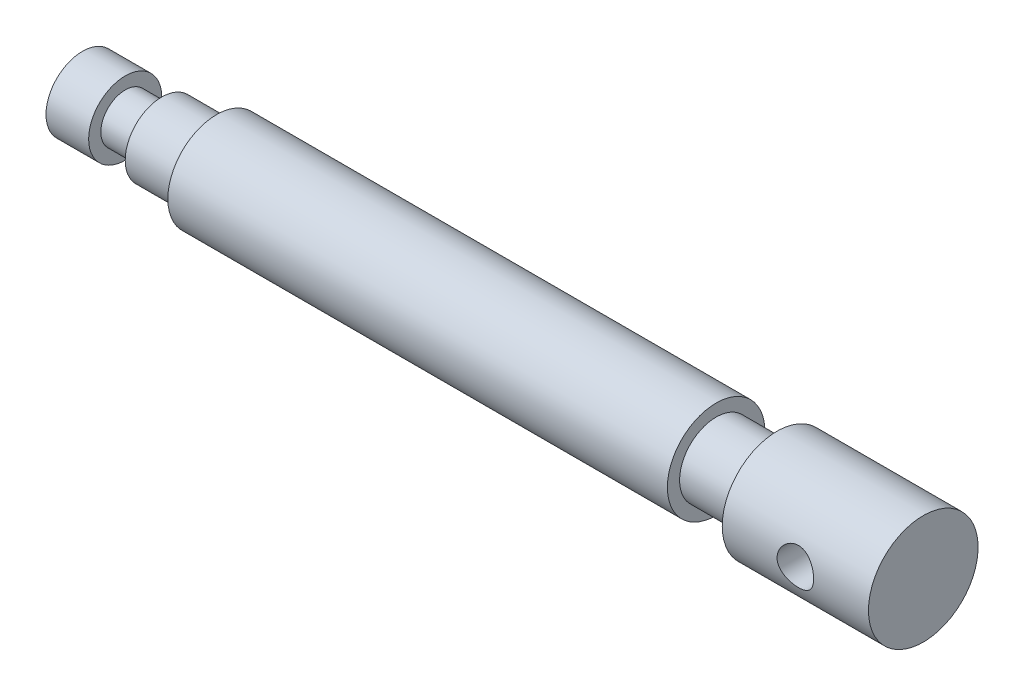
ISO-10303-21;
HEADER;
FILE_DESCRIPTION(('STEP AP214'),'2;1');
FILE_NAME('part.step','',(''),(''),'','','');
FILE_SCHEMA(('AUTOMOTIVE_DESIGN { 1 0 10303 214 1 1 1 1 }'));
ENDSEC;
DATA;
#1=APPLICATION_CONTEXT('core data for automotive mechanical design processes');
#2=APPLICATION_PROTOCOL_DEFINITION('international standard','automotive_design',2000,#1);
#3=PRODUCT_CONTEXT('',#1,'mechanical');
#4=PRODUCT('Part','Part','',(#3));
#5=PRODUCT_RELATED_PRODUCT_CATEGORY('part','',(#4));
#6=PRODUCT_DEFINITION_FORMATION('','',#4);
#7=PRODUCT_DEFINITION_CONTEXT('part definition',#1,'design');
#8=PRODUCT_DEFINITION('design','',#6,#7);
#9=PRODUCT_DEFINITION_SHAPE('','',#8);
#10=(LENGTH_UNIT() NAMED_UNIT(*) SI_UNIT(.MILLI.,.METRE.));
#11=(NAMED_UNIT(*) PLANE_ANGLE_UNIT() SI_UNIT($,.RADIAN.));
#12=(NAMED_UNIT(*) SI_UNIT($,.STERADIAN.) SOLID_ANGLE_UNIT());
#13=UNCERTAINTY_MEASURE_WITH_UNIT(LENGTH_MEASURE(1.E-05),#10,'distance_accuracy_value','');
#14=(GEOMETRIC_REPRESENTATION_CONTEXT(3) GLOBAL_UNCERTAINTY_ASSIGNED_CONTEXT((#13)) GLOBAL_UNIT_ASSIGNED_CONTEXT((#10,
#11,#12)) REPRESENTATION_CONTEXT('',''));
#15=CARTESIAN_POINT('',(0.,0.,0.));
#16=DIRECTION('',(0.,0.,1.));
#17=DIRECTION('',(1.,0.,0.));
#18=AXIS2_PLACEMENT_3D('',#15,#16,#17);
#19=CARTESIAN_POINT('',(0.,0.,0.));
#20=DIRECTION('',(1.,0.,0.));
#21=DIRECTION('',(0.,0.,-1.));
#22=AXIS2_PLACEMENT_3D('',#19,#20,#21);
#23=PLANE('',#22);
#24=CARTESIAN_POINT('',(0.,0.,0.));
#25=DIRECTION('',(-1.,0.,0.));
#26=DIRECTION('',(0.,0.,1.));
#27=AXIS2_PLACEMENT_3D('',#24,#25,#26);
#28=CIRCLE('',#27,6.);
#29=CARTESIAN_POINT('',(0.,0.,6.));
#30=VERTEX_POINT('',#29);
#31=EDGE_CURVE('E10',#30,#30,#28,.T.);
#32=ORIENTED_EDGE('',*,*,#31,.T.);
#33=EDGE_LOOP('',(#32));
#34=FACE_BOUND('',#33,.T.);
#35=ADVANCED_FACE('F41',(#34),#23,.F.);
#36=CARTESIAN_POINT('',(0.,0.,0.));
#37=DIRECTION('',(-1.,0.,0.));
#38=DIRECTION('',(0.,0.,1.));
#39=AXIS2_PLACEMENT_3D('',#36,#37,#38);
#40=CYLINDRICAL_SURFACE('',#39,6.);
#41=ORIENTED_EDGE('',*,*,#31,.F.);
#42=EDGE_LOOP('',(#41));
#43=FACE_BOUND('',#42,.T.);
#44=CARTESIAN_POINT('',(7.,0.,0.));
#45=DIRECTION('',(-1.,0.,0.));
#46=DIRECTION('',(0.,0.,1.));
#47=AXIS2_PLACEMENT_3D('',#44,#45,#46);
#48=CIRCLE('',#47,6.);
#49=CARTESIAN_POINT('',(7.,0.,6.));
#50=VERTEX_POINT('',#49);
#51=EDGE_CURVE('E54',#50,#50,#48,.T.);
#52=ORIENTED_EDGE('',*,*,#51,.T.);
#53=EDGE_LOOP('',(#52));
#54=FACE_BOUND('',#53,.T.);
#55=ADVANCED_FACE('F88',(#43,#54),#40,.T.);
#56=CARTESIAN_POINT('',(7.,6.,0.));
#57=DIRECTION('',(-1.,0.,0.));
#58=DIRECTION('',(0.,0.,1.));
#59=AXIS2_PLACEMENT_3D('',#56,#57,#58);
#60=PLANE('',#59);
#61=ORIENTED_EDGE('',*,*,#51,.F.);
#62=EDGE_LOOP('',(#61));
#63=FACE_BOUND('',#62,.T.);
#64=CARTESIAN_POINT('',(7.,0.,0.));
#65=DIRECTION('',(-1.,0.,0.));
#66=DIRECTION('',(0.,0.,1.));
#67=AXIS2_PLACEMENT_3D('',#64,#65,#66);
#68=CIRCLE('',#67,4.);
#69=CARTESIAN_POINT('',(7.,0.,4.));
#70=VERTEX_POINT('',#69);
#71=EDGE_CURVE('E60',#70,#70,#68,.T.);
#72=ORIENTED_EDGE('',*,*,#71,.T.);
#73=EDGE_LOOP('',(#72));
#74=FACE_BOUND('',#73,.T.);
#75=ADVANCED_FACE('F92',(#63,#74),#60,.F.);
#76=CARTESIAN_POINT('',(0.,0.,0.));
#77=DIRECTION('',(-1.,0.,0.));
#78=DIRECTION('',(0.,0.,1.));
#79=AXIS2_PLACEMENT_3D('',#76,#77,#78);
#80=CYLINDRICAL_SURFACE('',#79,4.);
#81=ORIENTED_EDGE('',*,*,#71,.F.);
#82=EDGE_LOOP('',(#81));
#83=FACE_BOUND('',#82,.T.);
#84=CARTESIAN_POINT('',(13.,0.,0.));
#85=DIRECTION('',(-1.,0.,0.));
#86=DIRECTION('',(0.,0.,1.));
#87=AXIS2_PLACEMENT_3D('',#84,#85,#86);
#88=CIRCLE('',#87,4.);
#89=CARTESIAN_POINT('',(13.,0.,4.));
#90=VERTEX_POINT('',#89);
#91=EDGE_CURVE('E169',#90,#90,#88,.T.);
#92=ORIENTED_EDGE('',*,*,#91,.T.);
#93=EDGE_LOOP('',(#92));
#94=FACE_BOUND('',#93,.T.);
#95=ADVANCED_FACE('F97',(#83,#94),#80,.T.);
#96=CARTESIAN_POINT('',(13.,4.,0.));
#97=DIRECTION('',(1.,0.,0.));
#98=DIRECTION('',(0.,0.,-1.));
#99=AXIS2_PLACEMENT_3D('',#96,#97,#98);
#100=PLANE('',#99);
#101=ORIENTED_EDGE('',*,*,#91,.F.);
#102=EDGE_LOOP('',(#101));
#103=FACE_BOUND('',#102,.T.);
#104=CARTESIAN_POINT('',(13.,0.,0.));
#105=DIRECTION('',(-1.,0.,0.));
#106=DIRECTION('',(0.,0.,1.));
#107=AXIS2_PLACEMENT_3D('',#104,#105,#106);
#108=CIRCLE('',#107,6.);
#109=CARTESIAN_POINT('',(13.,0.,6.));
#110=VERTEX_POINT('',#109);
#111=EDGE_CURVE('E165',#110,#110,#108,.T.);
#112=ORIENTED_EDGE('',*,*,#111,.T.);
#113=EDGE_LOOP('',(#112));
#114=FACE_BOUND('',#113,.T.);
#115=ADVANCED_FACE('F104',(#103,#114),#100,.F.);
#116=CARTESIAN_POINT('',(0.,0.,0.));
#117=DIRECTION('',(-1.,0.,0.));
#118=DIRECTION('',(0.,0.,1.));
#119=AXIS2_PLACEMENT_3D('',#116,#117,#118);
#120=CYLINDRICAL_SURFACE('',#119,6.);
#121=ORIENTED_EDGE('',*,*,#111,.F.);
#122=EDGE_LOOP('',(#121));
#123=FACE_BOUND('',#122,.T.);
#124=CARTESIAN_POINT('',(22.,0.,0.));
#125=DIRECTION('',(-1.,0.,0.));
#126=DIRECTION('',(0.,0.,1.));
#127=AXIS2_PLACEMENT_3D('',#124,#125,#126);
#128=CIRCLE('',#127,6.);
#129=CARTESIAN_POINT('',(22.,0.,6.));
#130=VERTEX_POINT('',#129);
#131=EDGE_CURVE('E161',#130,#130,#128,.T.);
#132=ORIENTED_EDGE('',*,*,#131,.T.);
#133=EDGE_LOOP('',(#132));
#134=FACE_BOUND('',#133,.T.);
#135=ADVANCED_FACE('F108',(#123,#134),#120,.T.);
#136=CARTESIAN_POINT('',(22.,6.,0.));
#137=DIRECTION('',(1.,0.,0.));
#138=DIRECTION('',(0.,0.,-1.));
#139=AXIS2_PLACEMENT_3D('',#136,#137,#138);
#140=PLANE('',#139);
#141=ORIENTED_EDGE('',*,*,#131,.F.);
#142=EDGE_LOOP('',(#141));
#143=FACE_BOUND('',#142,.T.);
#144=CARTESIAN_POINT('',(22.,0.,0.));
#145=DIRECTION('',(-1.,0.,0.));
#146=DIRECTION('',(0.,0.,1.));
#147=AXIS2_PLACEMENT_3D('',#144,#145,#146);
#148=CIRCLE('',#147,8.);
#149=CARTESIAN_POINT('',(22.,0.,8.));
#150=VERTEX_POINT('',#149);
#151=EDGE_CURVE('E157',#150,#150,#148,.T.);
#152=ORIENTED_EDGE('',*,*,#151,.T.);
#153=EDGE_LOOP('',(#152));
#154=FACE_BOUND('',#153,.T.);
#155=ADVANCED_FACE('F112',(#143,#154),#140,.F.);
#156=CARTESIAN_POINT('',(0.,0.,0.));
#157=DIRECTION('',(-1.,0.,0.));
#158=DIRECTION('',(0.,0.,1.));
#159=AXIS2_PLACEMENT_3D('',#156,#157,#158);
#160=CYLINDRICAL_SURFACE('',#159,8.);
#161=ORIENTED_EDGE('',*,*,#151,.F.);
#162=EDGE_LOOP('',(#161));
#163=FACE_BOUND('',#162,.T.);
#164=CARTESIAN_POINT('',(104.,0.,0.));
#165=DIRECTION('',(-1.,0.,0.));
#166=DIRECTION('',(0.,0.,1.));
#167=AXIS2_PLACEMENT_3D('',#164,#165,#166);
#168=CIRCLE('',#167,8.);
#169=CARTESIAN_POINT('',(104.,0.,8.));
#170=VERTEX_POINT('',#169);
#171=EDGE_CURVE('E153',#170,#170,#168,.T.);
#172=ORIENTED_EDGE('',*,*,#171,.T.);
#173=EDGE_LOOP('',(#172));
#174=FACE_BOUND('',#173,.T.);
#175=ADVANCED_FACE('F116',(#163,#174),#160,.T.);
#176=CARTESIAN_POINT('',(104.,8.,0.));
#177=DIRECTION('',(-1.,0.,0.));
#178=DIRECTION('',(0.,0.,1.));
#179=AXIS2_PLACEMENT_3D('',#176,#177,#178);
#180=PLANE('',#179);
#181=ORIENTED_EDGE('',*,*,#171,.F.);
#182=EDGE_LOOP('',(#181));
#183=FACE_BOUND('',#182,.T.);
#184=CARTESIAN_POINT('',(104.,0.,0.));
#185=DIRECTION('',(-1.,0.,0.));
#186=DIRECTION('',(0.,0.,1.));
#187=AXIS2_PLACEMENT_3D('',#184,#185,#186);
#188=CIRCLE('',#187,6.);
#189=CARTESIAN_POINT('',(104.,0.,6.));
#190=VERTEX_POINT('',#189);
#191=EDGE_CURVE('E145',#190,#190,#188,.T.);
#192=ORIENTED_EDGE('',*,*,#191,.T.);
#193=EDGE_LOOP('',(#192));
#194=FACE_BOUND('',#193,.T.);
#195=ADVANCED_FACE('F120',(#183,#194),#180,.F.);
#196=CARTESIAN_POINT('',(0.,0.,0.));
#197=DIRECTION('',(-1.,0.,0.));
#198=DIRECTION('',(0.,0.,1.));
#199=AXIS2_PLACEMENT_3D('',#196,#197,#198);
#200=CYLINDRICAL_SURFACE('',#199,6.);
#201=ORIENTED_EDGE('',*,*,#191,.F.);
#202=EDGE_LOOP('',(#201));
#203=FACE_BOUND('',#202,.T.);
#204=CARTESIAN_POINT('',(114.,0.,0.));
#205=DIRECTION('',(-1.,0.,0.));
#206=DIRECTION('',(0.,0.,1.));
#207=AXIS2_PLACEMENT_3D('',#204,#205,#206);
#208=CIRCLE('',#207,6.);
#209=CARTESIAN_POINT('',(114.,0.,6.));
#210=VERTEX_POINT('',#209);
#211=EDGE_CURVE('E135',#210,#210,#208,.T.);
#212=ORIENTED_EDGE('',*,*,#211,.T.);
#213=EDGE_LOOP('',(#212));
#214=FACE_BOUND('',#213,.T.);
#215=ADVANCED_FACE('F124',(#203,#214),#200,.T.);
#216=CARTESIAN_POINT('',(114.,6.,0.));
#217=DIRECTION('',(1.,0.,0.));
#218=DIRECTION('',(0.,0.,-1.));
#219=AXIS2_PLACEMENT_3D('',#216,#217,#218);
#220=PLANE('',#219);
#221=ORIENTED_EDGE('',*,*,#211,.F.);
#222=EDGE_LOOP('',(#221));
#223=FACE_BOUND('',#222,.T.);
#224=CARTESIAN_POINT('',(114.,0.,0.));
#225=DIRECTION('',(-1.,0.,0.));
#226=DIRECTION('',(0.,0.,1.));
#227=AXIS2_PLACEMENT_3D('',#224,#225,#226);
#228=CIRCLE('',#227,9.);
#229=CARTESIAN_POINT('',(114.,0.,9.));
#230=VERTEX_POINT('',#229);
#231=EDGE_CURVE('E138',#230,#230,#228,.T.);
#232=ORIENTED_EDGE('',*,*,#231,.T.);
#233=EDGE_LOOP('',(#232));
#234=FACE_BOUND('',#233,.T.);
#235=ADVANCED_FACE('F84',(#223,#234),#220,.F.);
#236=CARTESIAN_POINT('',(0.,0.,0.));
#237=DIRECTION('',(-1.,0.,0.));
#238=DIRECTION('',(0.,0.,1.));
#239=AXIS2_PLACEMENT_3D('',#236,#237,#238);
#240=CYLINDRICAL_SURFACE('',#239,9.);
#241=CARTESIAN_POINT('',(129.,0.,9.));
#242=CARTESIAN_POINT('',(129.000000761195,-0.163690088660168,9.00000045902832));
#243=CARTESIAN_POINT('',(128.986559201618,-0.327375583615647,8.99549308522634));
#244=CARTESIAN_POINT('',(128.933312673548,-0.649925282618914,8.97795630609842));
#245=CARTESIAN_POINT('',(128.893504968153,-0.808788984356453,8.96492601606458));
#246=CARTESIAN_POINT('',(128.789042269848,-1.11699836850533,8.93175923719328));
#247=CARTESIAN_POINT('',(128.724428812622,-1.26635947765811,8.9116346319256));
#248=CARTESIAN_POINT('',(128.572376481485,-1.55212481041598,8.86633337152025));
#249=CARTESIAN_POINT('',(128.484933104992,-1.68852647087612,8.84115572003334));
#250=CARTESIAN_POINT('',(128.286522585424,-1.94922502506679,8.78742283329015));
#251=CARTESIAN_POINT('',(128.174906297219,-2.07301110089492,8.75878669391355));
#252=CARTESIAN_POINT('',(127.93269853588,-2.30049807810625,8.70180944349364));
#253=CARTESIAN_POINT('',(127.802102895214,-2.40419455646838,8.67346839871647));
#254=CARTESIAN_POINT('',(127.521044654411,-2.59147482668358,8.61939997431822));
#255=CARTESIAN_POINT('',(127.370118780804,-2.6743945746631,8.59377117827064));
#256=CARTESIAN_POINT('',(127.055471716624,-2.81345662163316,8.54925916255804));
#257=CARTESIAN_POINT('',(126.891754448512,-2.86960709216029,8.53037388482237));
#258=CARTESIAN_POINT('',(126.56198033551,-2.95162038452748,8.50233909808132));
#259=CARTESIAN_POINT('',(126.396188374533,-2.9784403448153,8.49288287308834));
#260=CARTESIAN_POINT('',(126.062208737532,-3.00402337000343,8.48386969888523));
#261=CARTESIAN_POINT('',(125.894021817872,-3.00279510481415,8.4843096906819));
#262=CARTESIAN_POINT('',(125.568190108668,-2.97305971111025,8.49477045024541));
#263=CARTESIAN_POINT('',(125.410414791243,-2.94580173950098,8.50435247602599));
#264=CARTESIAN_POINT('',(125.101819741179,-2.86681848854824,8.53129973173653));
#265=CARTESIAN_POINT('',(124.951000843695,-2.8150902797756,8.54866589352323));
#266=CARTESIAN_POINT('',(124.657761751226,-2.68781717418062,8.58953733393747));
#267=CARTESIAN_POINT('',(124.515515923591,-2.61190214612178,8.61313697379352));
#268=CARTESIAN_POINT('',(124.245387275161,-2.43866731890941,8.6637767572718));
#269=CARTESIAN_POINT('',(124.1175086192,-2.34134133709201,8.69081789371391));
#270=CARTESIAN_POINT('',(123.872725205518,-2.1220479980467,8.74701987503223));
#271=CARTESIAN_POINT('',(123.756741916473,-1.99905945022893,8.77621768064529));
#272=CARTESIAN_POINT('',(123.54680620001,-1.73501870991019,8.8322081516111));
#273=CARTESIAN_POINT('',(123.452855885507,-1.59396478698244,8.85900058614202));
#274=CARTESIAN_POINT('',(123.288911099295,-1.2958428391388,8.90751323813381));
#275=CARTESIAN_POINT('',(123.219163525978,-1.138629829249,8.92918050024118));
#276=CARTESIAN_POINT('',(123.107390478133,-0.813807250093516,8.96461701433304));
#277=CARTESIAN_POINT('',(123.06535537373,-0.646201314464853,8.97838900964638));
#278=CARTESIAN_POINT('',(123.011833001933,-0.313151488587904,8.99602881214321));
#279=CARTESIAN_POINT('',(122.999100572482,-0.147928799594531,9.00030005501184));
#280=CARTESIAN_POINT('',(123.000998020795,0.182325209880718,8.99966708084482));
#281=CARTESIAN_POINT('',(123.01562327994,0.347356557958957,8.99476441258087));
#282=CARTESIAN_POINT('',(123.070835723208,0.667559598912772,8.97660074151313));
#283=CARTESIAN_POINT('',(123.110658618148,0.822878420504535,8.96358596133577));
#284=CARTESIAN_POINT('',(123.2141803334,1.12456787573872,8.9307554049021));
#285=CARTESIAN_POINT('',(123.277882198403,1.27093736552582,8.91093876140025));
#286=CARTESIAN_POINT('',(123.429211295522,1.55486488917982,8.86586793861869));
#287=CARTESIAN_POINT('',(123.51742377985,1.69208987765145,8.84048444267358));
#288=CARTESIAN_POINT('',(123.71458245004,1.95019449040676,8.78715761748787));
#289=CARTESIAN_POINT('',(123.823534968095,2.07106910338673,8.75921350781483));
#290=CARTESIAN_POINT('',(124.06493625302,2.2987575234189,8.70230543941334));
#291=CARTESIAN_POINT('',(124.198227680781,2.40468290773732,8.67335283262284));
#292=CARTESIAN_POINT('',(124.481314703433,2.59277256697073,8.61899919884126));
#293=CARTESIAN_POINT('',(124.631110435902,2.67493664379304,8.59359820146007));
#294=CARTESIAN_POINT('',(124.94301904587,2.81279079124908,8.54947175374151));
#295=CARTESIAN_POINT('',(125.105106237506,2.86853439649506,8.53073282378937));
#296=CARTESIAN_POINT('',(125.437135950132,2.95168400027806,8.50232496919349));
#297=CARTESIAN_POINT('',(125.607074896213,2.97910276486182,8.49265195870918));
#298=CARTESIAN_POINT('',(125.940591288123,3.00382884743202,8.48393576622532));
#299=CARTESIAN_POINT('',(126.10404702086,3.00261077192519,8.48437200772245));
#300=CARTESIAN_POINT('',(126.428295224766,2.97372688034607,8.49453809471602));
#301=CARTESIAN_POINT('',(126.589087853865,2.94606263837575,8.50426738708085));
#302=CARTESIAN_POINT('',(126.900406989007,2.86611543938802,8.53153572914676));
#303=CARTESIAN_POINT('',(127.051070475014,2.81431003804652,8.54892294067433));
#304=CARTESIAN_POINT('',(127.341682220815,2.68793809727922,8.58949196455406));
#305=CARTESIAN_POINT('',(127.481628093564,2.6133665056614,8.6126750629018));
#306=CARTESIAN_POINT('',(127.753451009769,2.43978207775028,8.66348487678139));
#307=CARTESIAN_POINT('',(127.884709505695,2.33984472829373,8.69126134926412));
#308=CARTESIAN_POINT('',(128.129069440153,2.11992864940694,8.74750068849759));
#309=CARTESIAN_POINT('',(128.242165727064,1.99994425335444,8.77596374737117));
#310=CARTESIAN_POINT('',(128.451433236868,1.73772467076206,8.83170091576632));
#311=CARTESIAN_POINT('',(128.546773043253,1.59480454049917,8.8588854540377));
#312=CARTESIAN_POINT('',(128.711971286552,1.29407207221985,8.90777973517837));
#313=CARTESIAN_POINT('',(128.781836237766,1.13626355439703,8.9294908772379));
#314=CARTESIAN_POINT('',(128.891164897466,0.817480941602912,8.96416545205626));
#315=CARTESIAN_POINT('',(128.93184739879,0.656963273029215,8.97747637267568));
#316=CARTESIAN_POINT('',(128.986260842031,0.330961248030737,8.99539221192665));
#317=CARTESIAN_POINT('',(128.99999923049,0.165478276706237,8.99999953595715));
#318=CARTESIAN_POINT('',(129.,0.,9.));
#319=B_SPLINE_CURVE_WITH_KNOTS('',3,(#241,#242,#243,#244,#245,#246,#247,#248,#249,#250,#251,
#252,#253,#254,#255,#256,#257,#258,#259,#260,#261,#262,#263,#264,#265,#266,#267,#268,#269,#270,
#271,#272,#273,#274,#275,#276,#277,#278,#279,#280,#281,#282,#283,#284,#285,#286,#287,#288,#289,
#290,#291,#292,#293,#294,#295,#296,#297,#298,#299,#300,#301,#302,#303,#304,#305,#306,#307,#308,
#309,#310,#311,#312,#313,#314,#315,#316,#317,#318),.UNSPECIFIED.,.T.,.F.,(4,2,2,2,2,2,2,2,2,2,2,
2,2,2,2,2,2,2,2,2,2,2,2,2,2,2,2,2,2,2,2,2,2,2,2,2,2,2,4),(0.,0.490461318078029,
0.980973555802563,1.47066801861083,1.96045913339731,2.46554052848266,2.97073299862591,
3.49045154470411,4.01001134078499,4.51205777225523,5.01394901962458,5.49290479653844,
5.97191792566448,6.45864513465392,6.94551307674621,7.457799174341,7.97013437899854,
8.48755216951072,9.00479006631624,9.49960749525508,9.99434139492529,10.4747447393464,
10.9552093585231,11.4483119953121,11.9415654246567,12.4572306864225,12.9729002470499,
13.4875204148031,14.0019085411752,14.4898699819277,14.9778023805413,15.4564676124125,
15.9352391452793,16.4349020007541,16.9347063337134,17.453989825053,17.9731404345737,
18.4690967512144,18.9649159811442),.UNSPECIFIED.);
#320=CARTESIAN_POINT('',(129.,0.,9.));
#321=VERTEX_POINT('',#320);
#322=EDGE_CURVE('E44',#321,#321,#319,.T.);
#323=ORIENTED_EDGE('',*,*,#322,.T.);
#324=EDGE_LOOP('',(#323));
#325=FACE_BOUND('',#324,.T.);
#326=CARTESIAN_POINT('',(129.,0.,-9.));
#327=CARTESIAN_POINT('',(129.000000761195,0.163690088660168,-9.00000045902832));
#328=CARTESIAN_POINT('',(128.986559201618,0.327375583615647,-8.99549308522634));
#329=CARTESIAN_POINT('',(128.933312673548,0.649925282618914,-8.97795630609842));
#330=CARTESIAN_POINT('',(128.893504968153,0.808788984356453,-8.96492601606458));
#331=CARTESIAN_POINT('',(128.789042269848,1.11699836850533,-8.93175923719328));
#332=CARTESIAN_POINT('',(128.724428812622,1.26635947765811,-8.9116346319256));
#333=CARTESIAN_POINT('',(128.572376481485,1.55212481041598,-8.86633337152025));
#334=CARTESIAN_POINT('',(128.484933104992,1.68852647087612,-8.84115572003334));
#335=CARTESIAN_POINT('',(128.286522585424,1.94922502506679,-8.78742283329015));
#336=CARTESIAN_POINT('',(128.174906297219,2.07301110089492,-8.75878669391355));
#337=CARTESIAN_POINT('',(127.93269853588,2.30049807810625,-8.70180944349364));
#338=CARTESIAN_POINT('',(127.802102895214,2.40419455646838,-8.67346839871647));
#339=CARTESIAN_POINT('',(127.521044654411,2.59147482668358,-8.61939997431822));
#340=CARTESIAN_POINT('',(127.370118780804,2.6743945746631,-8.59377117827064));
#341=CARTESIAN_POINT('',(127.055471716624,2.81345662163316,-8.54925916255804));
#342=CARTESIAN_POINT('',(126.891754448512,2.86960709216029,-8.53037388482237));
#343=CARTESIAN_POINT('',(126.56198033551,2.95162038452748,-8.50233909808132));
#344=CARTESIAN_POINT('',(126.396188374533,2.9784403448153,-8.49288287308834));
#345=CARTESIAN_POINT('',(126.062208737532,3.00402337000343,-8.48386969888523));
#346=CARTESIAN_POINT('',(125.894021817872,3.00279510481415,-8.4843096906819));
#347=CARTESIAN_POINT('',(125.568190108668,2.97305971111025,-8.49477045024541));
#348=CARTESIAN_POINT('',(125.410414791243,2.94580173950098,-8.50435247602599));
#349=CARTESIAN_POINT('',(125.101819741179,2.86681848854824,-8.53129973173653));
#350=CARTESIAN_POINT('',(124.951000843695,2.8150902797756,-8.54866589352323));
#351=CARTESIAN_POINT('',(124.657761751226,2.68781717418062,-8.58953733393747));
#352=CARTESIAN_POINT('',(124.515515923591,2.61190214612178,-8.61313697379352));
#353=CARTESIAN_POINT('',(124.245387275161,2.43866731890941,-8.6637767572718));
#354=CARTESIAN_POINT('',(124.1175086192,2.34134133709201,-8.69081789371391));
#355=CARTESIAN_POINT('',(123.872725205518,2.1220479980467,-8.74701987503223));
#356=CARTESIAN_POINT('',(123.756741916473,1.99905945022893,-8.77621768064529));
#357=CARTESIAN_POINT('',(123.54680620001,1.73501870991019,-8.8322081516111));
#358=CARTESIAN_POINT('',(123.452855885507,1.59396478698244,-8.85900058614202));
#359=CARTESIAN_POINT('',(123.288911099295,1.2958428391388,-8.90751323813381));
#360=CARTESIAN_POINT('',(123.219163525978,1.138629829249,-8.92918050024118));
#361=CARTESIAN_POINT('',(123.107390478133,0.813807250093516,-8.96461701433304));
#362=CARTESIAN_POINT('',(123.06535537373,0.646201314464853,-8.97838900964638));
#363=CARTESIAN_POINT('',(123.011833001933,0.313151488587904,-8.99602881214321));
#364=CARTESIAN_POINT('',(122.999100572482,0.147928799594531,-9.00030005501184));
#365=CARTESIAN_POINT('',(123.000998020795,-0.182325209880718,-8.99966708084482));
#366=CARTESIAN_POINT('',(123.01562327994,-0.347356557958957,-8.99476441258087));
#367=CARTESIAN_POINT('',(123.070835723208,-0.667559598912772,-8.97660074151313));
#368=CARTESIAN_POINT('',(123.110658618148,-0.822878420504535,-8.96358596133577));
#369=CARTESIAN_POINT('',(123.2141803334,-1.12456787573872,-8.9307554049021));
#370=CARTESIAN_POINT('',(123.277882198403,-1.27093736552582,-8.91093876140025));
#371=CARTESIAN_POINT('',(123.429211295522,-1.55486488917982,-8.86586793861869));
#372=CARTESIAN_POINT('',(123.51742377985,-1.69208987765145,-8.84048444267358));
#373=CARTESIAN_POINT('',(123.71458245004,-1.95019449040676,-8.78715761748787));
#374=CARTESIAN_POINT('',(123.823534968095,-2.07106910338673,-8.75921350781483));
#375=CARTESIAN_POINT('',(124.06493625302,-2.2987575234189,-8.70230543941334));
#376=CARTESIAN_POINT('',(124.198227680781,-2.40468290773732,-8.67335283262284));
#377=CARTESIAN_POINT('',(124.481314703433,-2.59277256697073,-8.61899919884126));
#378=CARTESIAN_POINT('',(124.631110435902,-2.67493664379304,-8.59359820146007));
#379=CARTESIAN_POINT('',(124.94301904587,-2.81279079124908,-8.54947175374151));
#380=CARTESIAN_POINT('',(125.105106237506,-2.86853439649506,-8.53073282378937));
#381=CARTESIAN_POINT('',(125.437135950132,-2.95168400027806,-8.50232496919349));
#382=CARTESIAN_POINT('',(125.607074896213,-2.97910276486182,-8.49265195870918));
#383=CARTESIAN_POINT('',(125.940591288123,-3.00382884743202,-8.48393576622532));
#384=CARTESIAN_POINT('',(126.10404702086,-3.00261077192519,-8.48437200772245));
#385=CARTESIAN_POINT('',(126.428295224766,-2.97372688034607,-8.49453809471602));
#386=CARTESIAN_POINT('',(126.589087853865,-2.94606263837575,-8.50426738708085));
#387=CARTESIAN_POINT('',(126.900406989007,-2.86611543938802,-8.53153572914676));
#388=CARTESIAN_POINT('',(127.051070475014,-2.81431003804652,-8.54892294067433));
#389=CARTESIAN_POINT('',(127.341682220815,-2.68793809727922,-8.58949196455406));
#390=CARTESIAN_POINT('',(127.481628093564,-2.6133665056614,-8.6126750629018));
#391=CARTESIAN_POINT('',(127.753451009769,-2.43978207775028,-8.66348487678139));
#392=CARTESIAN_POINT('',(127.884709505695,-2.33984472829373,-8.69126134926412));
#393=CARTESIAN_POINT('',(128.129069440153,-2.11992864940694,-8.74750068849759));
#394=CARTESIAN_POINT('',(128.242165727064,-1.99994425335444,-8.77596374737117));
#395=CARTESIAN_POINT('',(128.451433236868,-1.73772467076206,-8.83170091576632));
#396=CARTESIAN_POINT('',(128.546773043253,-1.59480454049917,-8.8588854540377));
#397=CARTESIAN_POINT('',(128.711971286552,-1.29407207221985,-8.90777973517837));
#398=CARTESIAN_POINT('',(128.781836237766,-1.13626355439703,-8.9294908772379));
#399=CARTESIAN_POINT('',(128.891164897466,-0.817480941602912,-8.96416545205626));
#400=CARTESIAN_POINT('',(128.93184739879,-0.656963273029215,-8.97747637267568));
#401=CARTESIAN_POINT('',(128.986260842031,-0.330961248030737,-8.99539221192665));
#402=CARTESIAN_POINT('',(128.99999923049,-0.165478276706237,-8.99999953595715));
#403=CARTESIAN_POINT('',(129.,0.,-9.));
#404=B_SPLINE_CURVE_WITH_KNOTS('',3,(#326,#327,#328,#329,#330,#331,#332,#333,#334,#335,#336,
#337,#338,#339,#340,#341,#342,#343,#344,#345,#346,#347,#348,#349,#350,#351,#352,#353,#354,#355,
#356,#357,#358,#359,#360,#361,#362,#363,#364,#365,#366,#367,#368,#369,#370,#371,#372,#373,#374,
#375,#376,#377,#378,#379,#380,#381,#382,#383,#384,#385,#386,#387,#388,#389,#390,#391,#392,#393,
#394,#395,#396,#397,#398,#399,#400,#401,#402,#403),.UNSPECIFIED.,.T.,.F.,(4,2,2,2,2,2,2,2,2,2,2,
2,2,2,2,2,2,2,2,2,2,2,2,2,2,2,2,2,2,2,2,2,2,2,2,2,2,2,4),(0.,0.490461318078029,
0.980973555802563,1.47066801861083,1.96045913339731,2.46554052848266,2.97073299862591,
3.49045154470411,4.01001134078499,4.51205777225523,5.01394901962458,5.49290479653844,
5.97191792566448,6.45864513465392,6.94551307674621,7.457799174341,7.97013437899854,
8.48755216951072,9.00479006631624,9.49960749525508,9.99434139492529,10.4747447393464,
10.9552093585231,11.4483119953121,11.9415654246567,12.4572306864225,12.9729002470499,
13.4875204148031,14.0019085411752,14.4898699819277,14.9778023805413,15.4564676124125,
15.9352391452793,16.4349020007541,16.9347063337134,17.453989825053,17.9731404345737,
18.4690967512144,18.9649159811442),.UNSPECIFIED.);
#405=CARTESIAN_POINT('',(129.,0.,-9.));
#406=VERTEX_POINT('',#405);
#407=EDGE_CURVE('E63',#406,#406,#404,.T.);
#408=ORIENTED_EDGE('',*,*,#407,.T.);
#409=EDGE_LOOP('',(#408));
#410=FACE_BOUND('',#409,.T.);
#411=ORIENTED_EDGE('',*,*,#231,.F.);
#412=EDGE_LOOP('',(#411));
#413=FACE_BOUND('',#412,.T.);
#414=CARTESIAN_POINT('',(138.,0.,0.));
#415=DIRECTION('',(-1.,0.,0.));
#416=DIRECTION('',(0.,0.,1.));
#417=AXIS2_PLACEMENT_3D('',#414,#415,#416);
#418=CIRCLE('',#417,9.);
#419=CARTESIAN_POINT('',(138.,0.,9.));
#420=VERTEX_POINT('',#419);
#421=EDGE_CURVE('E141',#420,#420,#418,.T.);
#422=ORIENTED_EDGE('',*,*,#421,.T.);
#423=EDGE_LOOP('',(#422));
#424=FACE_BOUND('',#423,.T.);
#425=ADVANCED_FACE('F69',(#325,#410,#413,#424),#240,.T.);
#426=CARTESIAN_POINT('',(138.,9.,0.));
#427=DIRECTION('',(-1.,0.,0.));
#428=DIRECTION('',(0.,0.,1.));
#429=AXIS2_PLACEMENT_3D('',#426,#427,#428);
#430=PLANE('',#429);
#431=ORIENTED_EDGE('',*,*,#421,.F.);
#432=EDGE_LOOP('',(#431));
#433=FACE_BOUND('',#432,.T.);
#434=ADVANCED_FACE('F76',(#433),#430,.F.);
#435=CARTESIAN_POINT('',(126.,0.,-30.));
#436=DIRECTION('',(0.,0.,1.));
#437=DIRECTION('',(1.,0.,0.));
#438=AXIS2_PLACEMENT_3D('',#435,#436,#437);
#439=CYLINDRICAL_SURFACE('',#438,2.99999999999999);
#440=ORIENTED_EDGE('',*,*,#407,.F.);
#441=EDGE_LOOP('',(#440));
#442=FACE_BOUND('',#441,.T.);
#443=ORIENTED_EDGE('',*,*,#322,.F.);
#444=EDGE_LOOP('',(#443));
#445=FACE_BOUND('',#444,.T.);
#446=ADVANCED_FACE('F73',(#442,#445),#439,.F.);
#447=CLOSED_SHELL('',(#35,#55,#75,#95,#115,#135,#155,#175,#195,#215,#235,#425,#434,#446));
#448=MANIFOLD_SOLID_BREP('B2',#447);
#449=ADVANCED_BREP_SHAPE_REPRESENTATION('',(#18,#448),#14);
#450=SHAPE_DEFINITION_REPRESENTATION(#9,#449);
ENDSEC;
END-ISO-10303-21;
